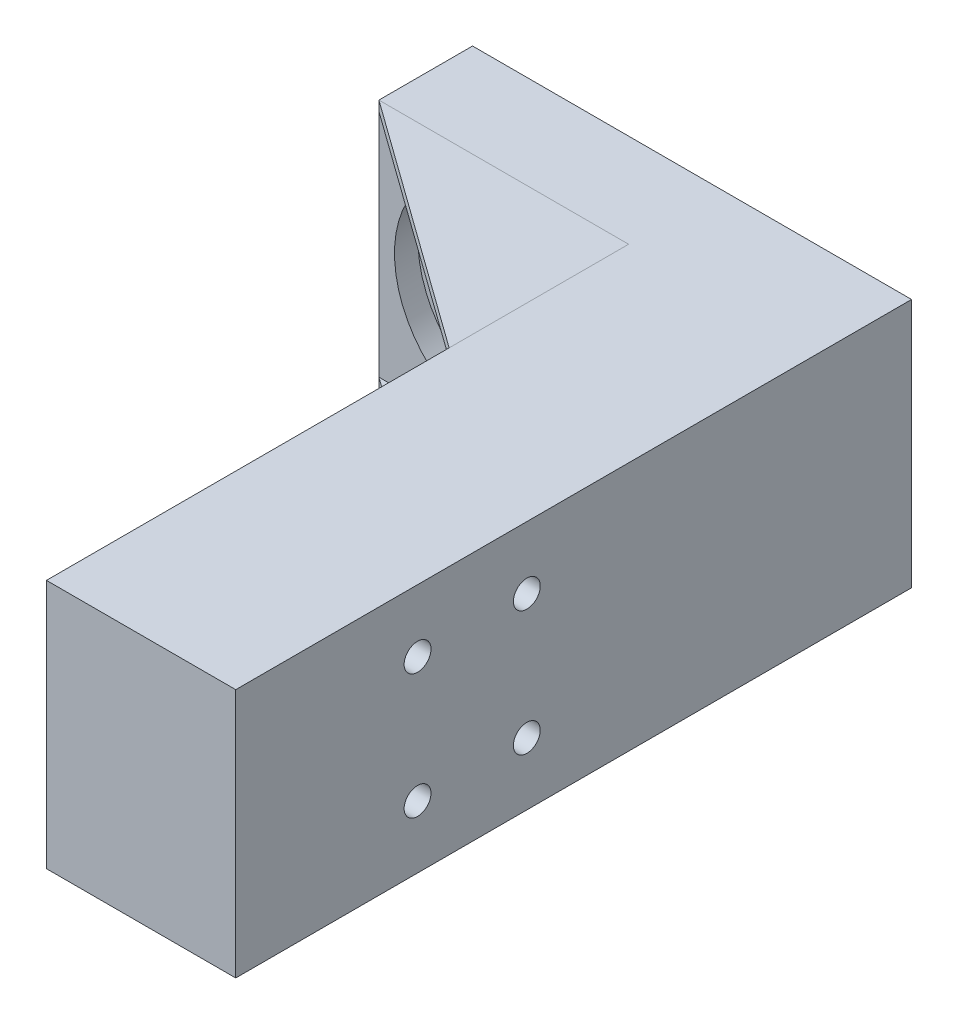
ISO-10303-21;
HEADER;
FILE_DESCRIPTION(('STEP AP214'),'2;1');
FILE_NAME('part.step','',(''),(''),'','','');
FILE_SCHEMA(('AUTOMOTIVE_DESIGN { 1 0 10303 214 1 1 1 1 }'));
ENDSEC;
DATA;
#1=APPLICATION_CONTEXT('core data for automotive mechanical design processes');
#2=APPLICATION_PROTOCOL_DEFINITION('international standard','automotive_design',2000,#1);
#3=PRODUCT_CONTEXT('',#1,'mechanical');
#4=PRODUCT('Part','Part','',(#3));
#5=PRODUCT_RELATED_PRODUCT_CATEGORY('part','',(#4));
#6=PRODUCT_DEFINITION_FORMATION('','',#4);
#7=PRODUCT_DEFINITION_CONTEXT('part definition',#1,'design');
#8=PRODUCT_DEFINITION('design','',#6,#7);
#9=PRODUCT_DEFINITION_SHAPE('','',#8);
#10=(LENGTH_UNIT() NAMED_UNIT(*) SI_UNIT(.MILLI.,.METRE.));
#11=(NAMED_UNIT(*) PLANE_ANGLE_UNIT() SI_UNIT($,.RADIAN.));
#12=(NAMED_UNIT(*) SI_UNIT($,.STERADIAN.) SOLID_ANGLE_UNIT());
#13=UNCERTAINTY_MEASURE_WITH_UNIT(LENGTH_MEASURE(1.E-05),#10,'distance_accuracy_value','');
#14=(GEOMETRIC_REPRESENTATION_CONTEXT(3) GLOBAL_UNCERTAINTY_ASSIGNED_CONTEXT((#13)) GLOBAL_UNIT_ASSIGNED_CONTEXT((#10,
#11,#12)) REPRESENTATION_CONTEXT('',''));
#15=CARTESIAN_POINT('',(0.,0.,0.));
#16=DIRECTION('',(0.,0.,1.));
#17=DIRECTION('',(1.,0.,0.));
#18=AXIS2_PLACEMENT_3D('',#15,#16,#17);
#19=CARTESIAN_POINT('',(0.,30.75,0.));
#20=DIRECTION('',(0.,1.,0.));
#21=DIRECTION('',(0.,0.,1.));
#22=AXIS2_PLACEMENT_3D('',#19,#20,#21);
#23=PLANE('',#22);
#24=DIRECTION('',(-1.,0.,0.));
#25=VECTOR('',#24,1.);
#26=CARTESIAN_POINT('',(0.,30.75,12.));
#27=LINE('',#26,#25);
#28=CARTESIAN_POINT('',(0.,30.75,12.));
#29=VERTEX_POINT('',#28);
#30=CARTESIAN_POINT('',(-32.,30.75,12.));
#31=VERTEX_POINT('',#30);
#32=EDGE_CURVE('E108',#29,#31,#27,.T.);
#33=ORIENTED_EDGE('',*,*,#32,.F.);
#34=DIRECTION('',(0.,0.,-1.));
#35=VECTOR('',#34,1.);
#36=CARTESIAN_POINT('',(0.,30.75,35.));
#37=LINE('',#36,#35);
#38=CARTESIAN_POINT('',(0.,30.75,35.));
#39=VERTEX_POINT('',#38);
#40=EDGE_CURVE('E115',#39,#29,#37,.T.);
#41=ORIENTED_EDGE('',*,*,#40,.F.);
#42=DIRECTION('',(0.812015371342713,0.,0.583636048152576));
#43=VECTOR('',#42,1.);
#44=CARTESIAN_POINT('',(-32.,30.75,12.));
#45=LINE('',#44,#43);
#46=EDGE_CURVE('E88',#31,#39,#45,.T.);
#47=ORIENTED_EDGE('',*,*,#46,.F.);
#48=EDGE_LOOP('',(#33,#41,#47));
#49=FACE_BOUND('',#48,.T.);
#50=ADVANCED_FACE('F79',(#49),#23,.F.);
#51=CARTESIAN_POINT('',(0.,32.,0.));
#52=DIRECTION('',(0.,1.,0.));
#53=DIRECTION('',(0.,0.,1.));
#54=AXIS2_PLACEMENT_3D('',#51,#52,#53);
#55=PLANE('',#54);
#56=DIRECTION('',(-1.,0.,0.));
#57=VECTOR('',#56,1.);
#58=CARTESIAN_POINT('',(0.,32.,12.));
#59=LINE('',#58,#57);
#60=CARTESIAN_POINT('',(0.,32.,12.));
#61=VERTEX_POINT('',#60);
#62=CARTESIAN_POINT('',(-32.,32.,12.));
#63=VERTEX_POINT('',#62);
#64=EDGE_CURVE('E128',#61,#63,#59,.T.);
#65=ORIENTED_EDGE('',*,*,#64,.T.);
#66=DIRECTION('',(0.812015371342713,0.,0.583636048152576));
#67=VECTOR('',#66,1.);
#68=CARTESIAN_POINT('',(-32.,32.,12.));
#69=LINE('',#68,#67);
#70=CARTESIAN_POINT('',(0.,32.,35.));
#71=VERTEX_POINT('',#70);
#72=EDGE_CURVE('E13',#63,#71,#69,.T.);
#73=ORIENTED_EDGE('',*,*,#72,.T.);
#74=DIRECTION('',(0.,0.,-1.));
#75=VECTOR('',#74,1.);
#76=CARTESIAN_POINT('',(0.,32.,35.));
#77=LINE('',#76,#75);
#78=EDGE_CURVE('E122',#71,#61,#77,.T.);
#79=ORIENTED_EDGE('',*,*,#78,.T.);
#80=EDGE_LOOP('',(#65,#73,#79));
#81=FACE_BOUND('',#80,.T.);
#82=ADVANCED_FACE('F152',(#81),#55,.T.);
#83=CARTESIAN_POINT('',(0.,32.,12.));
#84=DIRECTION('',(0.,0.,1.));
#85=DIRECTION('',(1.,0.,0.));
#86=AXIS2_PLACEMENT_3D('',#83,#84,#85);
#87=PLANE('',#86);
#88=ORIENTED_EDGE('',*,*,#32,.T.);
#89=DIRECTION('',(0.,-1.,0.));
#90=VECTOR('',#89,1.);
#91=CARTESIAN_POINT('',(-32.,32.,12.));
#92=LINE('',#91,#90);
#93=EDGE_CURVE('E120',#63,#31,#92,.T.);
#94=ORIENTED_EDGE('',*,*,#93,.F.);
#95=ORIENTED_EDGE('',*,*,#64,.F.);
#96=DIRECTION('',(0.,-1.,0.));
#97=VECTOR('',#96,1.);
#98=CARTESIAN_POINT('',(0.,32.,12.));
#99=LINE('',#98,#97);
#100=EDGE_CURVE('E134',#61,#29,#99,.T.);
#101=ORIENTED_EDGE('',*,*,#100,.T.);
#102=EDGE_LOOP('',(#88,#94,#95,#101));
#103=FACE_BOUND('',#102,.T.);
#104=ADVANCED_FACE('F153',(#103),#87,.F.);
#105=CARTESIAN_POINT('',(0.,32.,35.));
#106=DIRECTION('',(-1.,0.,0.));
#107=DIRECTION('',(0.,0.,1.));
#108=AXIS2_PLACEMENT_3D('',#105,#106,#107);
#109=PLANE('',#108);
#110=ORIENTED_EDGE('',*,*,#40,.T.);
#111=ORIENTED_EDGE('',*,*,#100,.F.);
#112=ORIENTED_EDGE('',*,*,#78,.F.);
#113=DIRECTION('',(0.,-1.,0.));
#114=VECTOR('',#113,1.);
#115=CARTESIAN_POINT('',(0.,32.,35.));
#116=LINE('',#115,#114);
#117=EDGE_CURVE('E119',#71,#39,#116,.T.);
#118=ORIENTED_EDGE('',*,*,#117,.T.);
#119=EDGE_LOOP('',(#110,#111,#112,#118));
#120=FACE_BOUND('',#119,.T.);
#121=ADVANCED_FACE('F124',(#120),#109,.F.);
#122=CARTESIAN_POINT('',(-32.,32.,12.));
#123=DIRECTION('',(0.583636048152576,0.,-0.812015371342713));
#124=DIRECTION('',(-0.812015371342713,0.,-0.583636048152576));
#125=AXIS2_PLACEMENT_3D('',#122,#123,#124);
#126=PLANE('',#125);
#127=ORIENTED_EDGE('',*,*,#46,.T.);
#128=ORIENTED_EDGE('',*,*,#117,.F.);
#129=ORIENTED_EDGE('',*,*,#72,.F.);
#130=ORIENTED_EDGE('',*,*,#93,.T.);
#131=EDGE_LOOP('',(#127,#128,#129,#130));
#132=FACE_BOUND('',#131,.T.);
#133=ADVANCED_FACE('F118',(#132),#126,.F.);
#134=CLOSED_SHELL('',(#50,#82,#104,#121,#133));
#135=MANIFOLD_SOLID_BREP('B2',#134);
#136=CARTESIAN_POINT('',(0.,0.,0.));
#137=DIRECTION('',(-1.,0.,0.));
#138=DIRECTION('',(0.,0.,1.));
#139=AXIS2_PLACEMENT_3D('',#136,#137,#138);
#140=PLANE('',#139);
#141=CARTESIAN_POINT('',(0.,24.,49.3));
#142=DIRECTION('',(-1.,0.,0.));
#143=DIRECTION('',(0.,0.,1.));
#144=AXIS2_PLACEMENT_3D('',#141,#142,#143);
#145=CIRCLE('',#144,1.72);
#146=CARTESIAN_POINT('',(0.,24.,51.02));
#147=VERTEX_POINT('',#146);
#148=EDGE_CURVE('E315',#147,#147,#145,.T.);
#149=ORIENTED_EDGE('',*,*,#148,.F.);
#150=EDGE_LOOP('',(#149));
#151=FACE_BOUND('',#150,.T.);
#152=CARTESIAN_POINT('',(0.,8.,63.3));
#153=DIRECTION('',(-1.,0.,0.));
#154=DIRECTION('',(0.,0.,1.));
#155=AXIS2_PLACEMENT_3D('',#152,#153,#154);
#156=CIRCLE('',#155,1.72);
#157=CARTESIAN_POINT('',(0.,8.,65.02));
#158=VERTEX_POINT('',#157);
#159=EDGE_CURVE('E324',#158,#158,#156,.T.);
#160=ORIENTED_EDGE('',*,*,#159,.F.);
#161=EDGE_LOOP('',(#160));
#162=FACE_BOUND('',#161,.T.);
#163=CARTESIAN_POINT('',(0.,8.,49.3));
#164=DIRECTION('',(-1.,0.,0.));
#165=DIRECTION('',(0.,0.,1.));
#166=AXIS2_PLACEMENT_3D('',#163,#164,#165);
#167=CIRCLE('',#166,1.72);
#168=CARTESIAN_POINT('',(0.,8.,51.02));
#169=VERTEX_POINT('',#168);
#170=EDGE_CURVE('E307',#169,#169,#167,.T.);
#171=ORIENTED_EDGE('',*,*,#170,.F.);
#172=EDGE_LOOP('',(#171));
#173=FACE_BOUND('',#172,.T.);
#174=CARTESIAN_POINT('',(0.,24.,63.3));
#175=DIRECTION('',(-1.,0.,0.));
#176=DIRECTION('',(0.,0.,1.));
#177=AXIS2_PLACEMENT_3D('',#174,#175,#176);
#178=CIRCLE('',#177,1.72);
#179=CARTESIAN_POINT('',(0.,24.,65.02));
#180=VERTEX_POINT('',#179);
#181=EDGE_CURVE('E319',#180,#180,#178,.T.);
#182=ORIENTED_EDGE('',*,*,#181,.F.);
#183=EDGE_LOOP('',(#182));
#184=FACE_BOUND('',#183,.T.);
#185=DIRECTION('',(0.,0.,-1.));
#186=VECTOR('',#185,1.);
#187=CARTESIAN_POINT('',(0.,1.25,12.));
#188=LINE('',#187,#186);
#189=CARTESIAN_POINT('',(0.,1.25,35.));
#190=VERTEX_POINT('',#189);
#191=CARTESIAN_POINT('',(0.,1.25,12.));
#192=VERTEX_POINT('',#191);
#193=EDGE_CURVE('E276',#190,#192,#188,.T.);
#194=ORIENTED_EDGE('',*,*,#193,.F.);
#195=DIRECTION('',(0.,-1.,0.));
#196=VECTOR('',#195,1.);
#197=CARTESIAN_POINT('',(0.,1.25,35.));
#198=LINE('',#197,#196);
#199=CARTESIAN_POINT('',(0.,0.,35.));
#200=VERTEX_POINT('',#199);
#201=EDGE_CURVE('E285',#190,#200,#198,.T.);
#202=ORIENTED_EDGE('',*,*,#201,.T.);
#203=DIRECTION('',(0.,0.,-1.));
#204=VECTOR('',#203,1.);
#205=CARTESIAN_POINT('',(0.,0.,0.));
#206=LINE('',#205,#204);
#207=CARTESIAN_POINT('',(0.,0.,86.6));
#208=VERTEX_POINT('',#207);
#209=EDGE_CURVE('E383',#208,#200,#206,.T.);
#210=ORIENTED_EDGE('',*,*,#209,.F.);
#211=DIRECTION('',(0.,-1.,0.));
#212=VECTOR('',#211,1.);
#213=CARTESIAN_POINT('',(0.,0.,86.6));
#214=LINE('',#213,#212);
#215=CARTESIAN_POINT('',(0.,32.,86.6));
#216=VERTEX_POINT('',#215);
#217=EDGE_CURVE('E246',#216,#208,#214,.T.);
#218=ORIENTED_EDGE('',*,*,#217,.F.);
#219=DIRECTION('',(0.,0.,1.));
#220=VECTOR('',#219,1.);
#221=CARTESIAN_POINT('',(0.,32.,0.));
#222=LINE('',#221,#220);
#223=CARTESIAN_POINT('',(0.,32.,12.));
#224=VERTEX_POINT('',#223);
#225=EDGE_CURVE('E402',#224,#216,#222,.T.);
#226=ORIENTED_EDGE('',*,*,#225,.F.);
#227=DIRECTION('',(0.,1.,0.));
#228=VECTOR('',#227,1.);
#229=CARTESIAN_POINT('',(0.,0.,12.));
#230=LINE('',#229,#228);
#231=EDGE_CURVE('E297',#192,#224,#230,.T.);
#232=ORIENTED_EDGE('',*,*,#231,.F.);
#233=EDGE_LOOP('',(#194,#202,#210,#218,#226,#232));
#234=FACE_BOUND('',#233,.T.);
#235=ADVANCED_FACE('F194',(#151,#162,#173,#184,#234),#140,.T.);
#236=CARTESIAN_POINT('',(0.,0.,12.));
#237=DIRECTION('',(0.,1.,0.));
#238=DIRECTION('',(0.,0.,1.));
#239=AXIS2_PLACEMENT_3D('',#236,#237,#238);
#240=PLANE('',#239);
#241=DIRECTION('',(1.,0.,0.));
#242=VECTOR('',#241,1.);
#243=CARTESIAN_POINT('',(0.,0.,0.));
#244=LINE('',#243,#242);
#245=CARTESIAN_POINT('',(-32.,0.,0.));
#246=VERTEX_POINT('',#245);
#247=CARTESIAN_POINT('',(24.2564424431943,0.,0.));
#248=VERTEX_POINT('',#247);
#249=EDGE_CURVE('E254',#246,#248,#244,.T.);
#250=ORIENTED_EDGE('',*,*,#249,.T.);
#251=DIRECTION('',(0.,0.,-1.));
#252=VECTOR('',#251,1.);
#253=CARTESIAN_POINT('',(24.2564424431943,0.,0.));
#254=LINE('',#253,#252);
#255=CARTESIAN_POINT('',(24.2564424431943,0.,86.6));
#256=VERTEX_POINT('',#255);
#257=EDGE_CURVE('E387',#256,#248,#254,.T.);
#258=ORIENTED_EDGE('',*,*,#257,.F.);
#259=DIRECTION('',(-1.,0.,0.));
#260=VECTOR('',#259,1.);
#261=CARTESIAN_POINT('',(24.2564424431943,0.,86.6));
#262=LINE('',#261,#260);
#263=EDGE_CURVE('E399',#256,#208,#262,.T.);
#264=ORIENTED_EDGE('',*,*,#263,.T.);
#265=ORIENTED_EDGE('',*,*,#209,.T.);
#266=DIRECTION('',(0.812015371342713,0.,0.583636048152575));
#267=VECTOR('',#266,1.);
#268=CARTESIAN_POINT('',(0.,0.,35.));
#269=LINE('',#268,#267);
#270=CARTESIAN_POINT('',(-32.,0.,12.));
#271=VERTEX_POINT('',#270);
#272=EDGE_CURVE('E282',#271,#200,#269,.T.);
#273=ORIENTED_EDGE('',*,*,#272,.F.);
#274=DIRECTION('',(0.,0.,-1.));
#275=VECTOR('',#274,1.);
#276=CARTESIAN_POINT('',(-32.,0.,12.));
#277=LINE('',#276,#275);
#278=EDGE_CURVE('E204',#271,#246,#277,.T.);
#279=ORIENTED_EDGE('',*,*,#278,.T.);
#280=EDGE_LOOP('',(#250,#258,#264,#265,#273,#279));
#281=FACE_BOUND('',#280,.T.);
#282=ADVANCED_FACE('F196',(#281),#240,.F.);
#283=CARTESIAN_POINT('',(0.,32.,12.));
#284=DIRECTION('',(0.,-1.,0.));
#285=DIRECTION('',(0.,0.,-1.));
#286=AXIS2_PLACEMENT_3D('',#283,#284,#285);
#287=PLANE('',#286);
#288=DIRECTION('',(-1.,0.,0.));
#289=VECTOR('',#288,1.);
#290=CARTESIAN_POINT('',(0.,32.,0.));
#291=LINE('',#290,#289);
#292=CARTESIAN_POINT('',(24.2564424431943,32.,0.));
#293=VERTEX_POINT('',#292);
#294=CARTESIAN_POINT('',(-32.,32.,0.));
#295=VERTEX_POINT('',#294);
#296=EDGE_CURVE('E222',#293,#295,#291,.T.);
#297=ORIENTED_EDGE('',*,*,#296,.T.);
#298=DIRECTION('',(0.,0.,-1.));
#299=VECTOR('',#298,1.);
#300=CARTESIAN_POINT('',(-32.,32.,12.));
#301=LINE('',#300,#299);
#302=CARTESIAN_POINT('',(-32.,32.,12.));
#303=VERTEX_POINT('',#302);
#304=EDGE_CURVE('E77',#303,#295,#301,.T.);
#305=ORIENTED_EDGE('',*,*,#304,.F.);
#306=DIRECTION('',(-1.,0.,0.));
#307=VECTOR('',#306,1.);
#308=CARTESIAN_POINT('',(0.,32.,12.));
#309=LINE('',#308,#307);
#310=EDGE_CURVE('E212',#224,#303,#309,.T.);
#311=ORIENTED_EDGE('',*,*,#310,.F.);
#312=ORIENTED_EDGE('',*,*,#225,.T.);
#313=DIRECTION('',(-1.,0.,0.));
#314=VECTOR('',#313,1.);
#315=CARTESIAN_POINT('',(24.2564424431943,32.,86.6));
#316=LINE('',#315,#314);
#317=CARTESIAN_POINT('',(24.2564424431943,32.,86.6));
#318=VERTEX_POINT('',#317);
#319=EDGE_CURVE('E409',#318,#216,#316,.T.);
#320=ORIENTED_EDGE('',*,*,#319,.F.);
#321=DIRECTION('',(0.,0.,1.));
#322=VECTOR('',#321,1.);
#323=CARTESIAN_POINT('',(24.2564424431943,32.,0.));
#324=LINE('',#323,#322);
#325=EDGE_CURVE('E394',#293,#318,#324,.T.);
#326=ORIENTED_EDGE('',*,*,#325,.F.);
#327=EDGE_LOOP('',(#297,#305,#311,#312,#320,#326));
#328=FACE_BOUND('',#327,.T.);
#329=ADVANCED_FACE('F433',(#328),#287,.F.);
#330=CARTESIAN_POINT('',(-32.,0.,12.));
#331=DIRECTION('',(1.,0.,0.));
#332=DIRECTION('',(0.,0.,-1.));
#333=AXIS2_PLACEMENT_3D('',#330,#331,#332);
#334=PLANE('',#333);
#335=DIRECTION('',(0.,-1.,0.));
#336=VECTOR('',#335,1.);
#337=CARTESIAN_POINT('',(-32.,0.,0.));
#338=LINE('',#337,#336);
#339=EDGE_CURVE('E414',#295,#246,#338,.T.);
#340=ORIENTED_EDGE('',*,*,#339,.T.);
#341=ORIENTED_EDGE('',*,*,#278,.F.);
#342=DIRECTION('',(0.,-1.,0.));
#343=VECTOR('',#342,1.);
#344=CARTESIAN_POINT('',(-32.,1.25,12.));
#345=LINE('',#344,#343);
#346=CARTESIAN_POINT('',(-32.,1.25,12.));
#347=VERTEX_POINT('',#346);
#348=EDGE_CURVE('E293',#347,#271,#345,.T.);
#349=ORIENTED_EDGE('',*,*,#348,.F.);
#350=DIRECTION('',(0.,-1.,0.));
#351=VECTOR('',#350,1.);
#352=CARTESIAN_POINT('',(-32.,0.,12.));
#353=LINE('',#352,#351);
#354=EDGE_CURVE('E417',#303,#347,#353,.T.);
#355=ORIENTED_EDGE('',*,*,#354,.F.);
#356=ORIENTED_EDGE('',*,*,#304,.T.);
#357=EDGE_LOOP('',(#340,#341,#349,#355,#356));
#358=FACE_BOUND('',#357,.T.);
#359=ADVANCED_FACE('F435',(#358),#334,.F.);
#360=CARTESIAN_POINT('',(0.,0.,12.));
#361=DIRECTION('',(0.,0.,-1.));
#362=DIRECTION('',(-1.,0.,0.));
#363=AXIS2_PLACEMENT_3D('',#360,#361,#362);
#364=PLANE('',#363);
#365=CARTESIAN_POINT('',(-16.,16.,12.));
#366=DIRECTION('',(0.,0.,1.));
#367=DIRECTION('',(1.,0.,0.));
#368=AXIS2_PLACEMENT_3D('',#365,#366,#367);
#369=CIRCLE('',#368,14.);
#370=CARTESIAN_POINT('',(-2.,16.,12.));
#371=VERTEX_POINT('',#370);
#372=EDGE_CURVE('E375',#371,#371,#369,.T.);
#373=ORIENTED_EDGE('',*,*,#372,.F.);
#374=EDGE_LOOP('',(#373));
#375=FACE_BOUND('',#374,.T.);
#376=ORIENTED_EDGE('',*,*,#354,.T.);
#377=DIRECTION('',(-1.,0.,0.));
#378=VECTOR('',#377,1.);
#379=CARTESIAN_POINT('',(-32.,1.25,12.));
#380=LINE('',#379,#378);
#381=EDGE_CURVE('E278',#192,#347,#380,.T.);
#382=ORIENTED_EDGE('',*,*,#381,.F.);
#383=ORIENTED_EDGE('',*,*,#231,.T.);
#384=ORIENTED_EDGE('',*,*,#310,.T.);
#385=EDGE_LOOP('',(#376,#382,#383,#384));
#386=FACE_BOUND('',#385,.T.);
#387=ADVANCED_FACE('F436',(#375,#386),#364,.F.);
#388=CARTESIAN_POINT('',(0.,0.,0.));
#389=DIRECTION('',(0.,0.,-1.));
#390=DIRECTION('',(-1.,0.,0.));
#391=AXIS2_PLACEMENT_3D('',#388,#389,#390);
#392=PLANE('',#391);
#393=CARTESIAN_POINT('',(-16.,25.35,0.));
#394=DIRECTION('',(0.,0.,1.));
#395=DIRECTION('',(1.,0.,0.));
#396=AXIS2_PLACEMENT_3D('',#393,#394,#395);
#397=CIRCLE('',#396,1.72);
#398=CARTESIAN_POINT('',(-14.28,25.35,0.));
#399=VERTEX_POINT('',#398);
#400=EDGE_CURVE('E339',#399,#399,#397,.T.);
#401=ORIENTED_EDGE('',*,*,#400,.T.);
#402=EDGE_LOOP('',(#401));
#403=FACE_BOUND('',#402,.T.);
#404=CARTESIAN_POINT('',(-16.,6.65,0.));
#405=DIRECTION('',(0.,0.,1.));
#406=DIRECTION('',(1.,0.,0.));
#407=AXIS2_PLACEMENT_3D('',#404,#405,#406);
#408=CIRCLE('',#407,1.72);
#409=CARTESIAN_POINT('',(-14.28,6.65,0.));
#410=VERTEX_POINT('',#409);
#411=EDGE_CURVE('E352',#410,#410,#408,.T.);
#412=ORIENTED_EDGE('',*,*,#411,.T.);
#413=EDGE_LOOP('',(#412));
#414=FACE_BOUND('',#413,.T.);
#415=CARTESIAN_POINT('',(-6.65,15.9999999999998,0.));
#416=DIRECTION('',(0.,0.,1.));
#417=DIRECTION('',(1.,0.,0.));
#418=AXIS2_PLACEMENT_3D('',#415,#416,#417);
#419=CIRCLE('',#418,1.72000000000007);
#420=CARTESIAN_POINT('',(-4.92999999999993,15.9999999999998,0.));
#421=VERTEX_POINT('',#420);
#422=EDGE_CURVE('E360',#421,#421,#419,.T.);
#423=ORIENTED_EDGE('',*,*,#422,.T.);
#424=EDGE_LOOP('',(#423));
#425=FACE_BOUND('',#424,.T.);
#426=CARTESIAN_POINT('',(-25.3078363428139,16.,0.));
#427=DIRECTION('',(0.,0.,1.));
#428=DIRECTION('',(1.,0.,0.));
#429=AXIS2_PLACEMENT_3D('',#426,#427,#428);
#430=CIRCLE('',#429,1.72);
#431=CARTESIAN_POINT('',(-23.5878363428139,16.,0.));
#432=VERTEX_POINT('',#431);
#433=EDGE_CURVE('E335',#432,#432,#430,.T.);
#434=ORIENTED_EDGE('',*,*,#433,.T.);
#435=EDGE_LOOP('',(#434));
#436=FACE_BOUND('',#435,.T.);
#437=CARTESIAN_POINT('',(-15.9578363428139,16.1108483942343,0.));
#438=DIRECTION('',(0.,0.,1.));
#439=DIRECTION('',(1.,0.,0.));
#440=AXIS2_PLACEMENT_3D('',#437,#438,#439);
#441=CIRCLE('',#440,3.);
#442=CARTESIAN_POINT('',(-12.9578363428139,16.1108483942343,0.));
#443=VERTEX_POINT('',#442);
#444=EDGE_CURVE('E371',#443,#443,#441,.T.);
#445=ORIENTED_EDGE('',*,*,#444,.T.);
#446=EDGE_LOOP('',(#445));
#447=FACE_BOUND('',#446,.T.);
#448=ORIENTED_EDGE('',*,*,#249,.F.);
#449=ORIENTED_EDGE('',*,*,#339,.F.);
#450=ORIENTED_EDGE('',*,*,#296,.F.);
#451=DIRECTION('',(0.,1.,0.));
#452=VECTOR('',#451,1.);
#453=CARTESIAN_POINT('',(24.2564424431943,0.,0.));
#454=LINE('',#453,#452);
#455=EDGE_CURVE('E390',#248,#293,#454,.T.);
#456=ORIENTED_EDGE('',*,*,#455,.F.);
#457=EDGE_LOOP('',(#448,#449,#450,#456));
#458=FACE_BOUND('',#457,.T.);
#459=ADVANCED_FACE('F430',(#403,#414,#425,#436,#447,#458),#392,.T.);
#460=CARTESIAN_POINT('',(24.2564424431943,0.,86.6));
#461=DIRECTION('',(0.,0.,-1.));
#462=DIRECTION('',(-1.,0.,0.));
#463=AXIS2_PLACEMENT_3D('',#460,#461,#462);
#464=PLANE('',#463);
#465=ORIENTED_EDGE('',*,*,#217,.T.);
#466=ORIENTED_EDGE('',*,*,#263,.F.);
#467=DIRECTION('',(0.,-1.,0.));
#468=VECTOR('',#467,1.);
#469=CARTESIAN_POINT('',(24.2564424431943,0.,86.6));
#470=LINE('',#469,#468);
#471=EDGE_CURVE('E231',#318,#256,#470,.T.);
#472=ORIENTED_EDGE('',*,*,#471,.F.);
#473=ORIENTED_EDGE('',*,*,#319,.T.);
#474=EDGE_LOOP('',(#465,#466,#472,#473));
#475=FACE_BOUND('',#474,.T.);
#476=ADVANCED_FACE('F445',(#475),#464,.F.);
#477=CARTESIAN_POINT('',(24.2564424431943,0.,0.));
#478=DIRECTION('',(-1.,0.,0.));
#479=DIRECTION('',(0.,0.,1.));
#480=AXIS2_PLACEMENT_3D('',#477,#478,#479);
#481=PLANE('',#480);
#482=CARTESIAN_POINT('',(24.2564424431943,24.,49.3));
#483=DIRECTION('',(-1.,0.,0.));
#484=DIRECTION('',(0.,0.,1.));
#485=AXIS2_PLACEMENT_3D('',#482,#483,#484);
#486=CIRCLE('',#485,1.72);
#487=CARTESIAN_POINT('',(24.2564424431943,24.,51.02));
#488=VERTEX_POINT('',#487);
#489=EDGE_CURVE('E320',#488,#488,#486,.T.);
#490=ORIENTED_EDGE('',*,*,#489,.T.);
#491=EDGE_LOOP('',(#490));
#492=FACE_BOUND('',#491,.T.);
#493=CARTESIAN_POINT('',(24.2564424431943,8.,63.3));
#494=DIRECTION('',(-1.,0.,0.));
#495=DIRECTION('',(0.,0.,1.));
#496=AXIS2_PLACEMENT_3D('',#493,#494,#495);
#497=CIRCLE('',#496,1.72);
#498=CARTESIAN_POINT('',(24.2564424431943,8.,65.02));
#499=VERTEX_POINT('',#498);
#500=EDGE_CURVE('E311',#499,#499,#497,.T.);
#501=ORIENTED_EDGE('',*,*,#500,.T.);
#502=EDGE_LOOP('',(#501));
#503=FACE_BOUND('',#502,.T.);
#504=CARTESIAN_POINT('',(24.2564424431943,8.,49.3));
#505=DIRECTION('',(-1.,0.,0.));
#506=DIRECTION('',(0.,0.,1.));
#507=AXIS2_PLACEMENT_3D('',#504,#505,#506);
#508=CIRCLE('',#507,1.72);
#509=CARTESIAN_POINT('',(24.2564424431943,8.,51.02));
#510=VERTEX_POINT('',#509);
#511=EDGE_CURVE('E292',#510,#510,#508,.T.);
#512=ORIENTED_EDGE('',*,*,#511,.T.);
#513=EDGE_LOOP('',(#512));
#514=FACE_BOUND('',#513,.T.);
#515=CARTESIAN_POINT('',(24.2564424431943,24.,63.3));
#516=DIRECTION('',(-1.,0.,0.));
#517=DIRECTION('',(0.,0.,1.));
#518=AXIS2_PLACEMENT_3D('',#515,#516,#517);
#519=CIRCLE('',#518,1.72);
#520=CARTESIAN_POINT('',(24.2564424431943,24.,65.02));
#521=VERTEX_POINT('',#520);
#522=EDGE_CURVE('E331',#521,#521,#519,.T.);
#523=ORIENTED_EDGE('',*,*,#522,.T.);
#524=EDGE_LOOP('',(#523));
#525=FACE_BOUND('',#524,.T.);
#526=ORIENTED_EDGE('',*,*,#257,.T.);
#527=ORIENTED_EDGE('',*,*,#455,.T.);
#528=ORIENTED_EDGE('',*,*,#325,.T.);
#529=ORIENTED_EDGE('',*,*,#471,.T.);
#530=EDGE_LOOP('',(#526,#527,#528,#529));
#531=FACE_BOUND('',#530,.T.);
#532=ADVANCED_FACE('F431',(#492,#503,#514,#525,#531),#481,.F.);
#533=CARTESIAN_POINT('',(-16.,16.,9.));
#534=DIRECTION('',(0.,0.,1.));
#535=DIRECTION('',(1.,0.,0.));
#536=AXIS2_PLACEMENT_3D('',#533,#534,#535);
#537=CYLINDRICAL_SURFACE('',#536,14.);
#538=CARTESIAN_POINT('',(-16.,16.,9.));
#539=DIRECTION('',(0.,0.,1.));
#540=DIRECTION('',(1.,0.,0.));
#541=AXIS2_PLACEMENT_3D('',#538,#539,#540);
#542=CIRCLE('',#541,14.);
#543=CARTESIAN_POINT('',(-2.,16.,9.));
#544=VERTEX_POINT('',#543);
#545=EDGE_CURVE('E379',#544,#544,#542,.T.);
#546=ORIENTED_EDGE('',*,*,#545,.F.);
#547=EDGE_LOOP('',(#546));
#548=FACE_BOUND('',#547,.T.);
#549=ORIENTED_EDGE('',*,*,#372,.T.);
#550=EDGE_LOOP('',(#549));
#551=FACE_BOUND('',#550,.T.);
#552=ADVANCED_FACE('F468',(#548,#551),#537,.F.);
#553=CARTESIAN_POINT('',(-16.,16.,9.));
#554=DIRECTION('',(0.,0.,1.));
#555=DIRECTION('',(1.,0.,0.));
#556=AXIS2_PLACEMENT_3D('',#553,#554,#555);
#557=PLANE('',#556);
#558=CARTESIAN_POINT('',(-16.,25.35,9.));
#559=DIRECTION('',(0.,0.,1.));
#560=DIRECTION('',(1.,0.,0.));
#561=AXIS2_PLACEMENT_3D('',#558,#559,#560);
#562=CIRCLE('',#561,1.72);
#563=CARTESIAN_POINT('',(-14.28,25.35,9.));
#564=VERTEX_POINT('',#563);
#565=EDGE_CURVE('E344',#564,#564,#562,.T.);
#566=ORIENTED_EDGE('',*,*,#565,.F.);
#567=EDGE_LOOP('',(#566));
#568=FACE_BOUND('',#567,.T.);
#569=CARTESIAN_POINT('',(-16.,6.65,9.));
#570=DIRECTION('',(0.,0.,1.));
#571=DIRECTION('',(1.,0.,0.));
#572=AXIS2_PLACEMENT_3D('',#569,#570,#571);
#573=CIRCLE('',#572,1.72);
#574=CARTESIAN_POINT('',(-14.28,6.65,9.));
#575=VERTEX_POINT('',#574);
#576=EDGE_CURVE('E348',#575,#575,#573,.T.);
#577=ORIENTED_EDGE('',*,*,#576,.F.);
#578=EDGE_LOOP('',(#577));
#579=FACE_BOUND('',#578,.T.);
#580=CARTESIAN_POINT('',(-6.65,15.9999999999998,9.));
#581=DIRECTION('',(0.,0.,1.));
#582=DIRECTION('',(1.,0.,0.));
#583=AXIS2_PLACEMENT_3D('',#580,#581,#582);
#584=CIRCLE('',#583,1.72000000000007);
#585=CARTESIAN_POINT('',(-4.92999999999993,15.9999999999998,9.));
#586=VERTEX_POINT('',#585);
#587=EDGE_CURVE('E356',#586,#586,#584,.T.);
#588=ORIENTED_EDGE('',*,*,#587,.F.);
#589=EDGE_LOOP('',(#588));
#590=FACE_BOUND('',#589,.T.);
#591=CARTESIAN_POINT('',(-25.3078363428139,16.,9.));
#592=DIRECTION('',(0.,0.,1.));
#593=DIRECTION('',(1.,0.,0.));
#594=AXIS2_PLACEMENT_3D('',#591,#592,#593);
#595=CIRCLE('',#594,1.72);
#596=CARTESIAN_POINT('',(-23.5878363428139,16.,9.));
#597=VERTEX_POINT('',#596);
#598=EDGE_CURVE('E364',#597,#597,#595,.T.);
#599=ORIENTED_EDGE('',*,*,#598,.F.);
#600=EDGE_LOOP('',(#599));
#601=FACE_BOUND('',#600,.T.);
#602=CARTESIAN_POINT('',(-15.9578363428139,16.1108483942343,9.));
#603=DIRECTION('',(0.,0.,1.));
#604=DIRECTION('',(1.,0.,0.));
#605=AXIS2_PLACEMENT_3D('',#602,#603,#604);
#606=CIRCLE('',#605,3.);
#607=CARTESIAN_POINT('',(-12.9578363428139,16.1108483942343,9.));
#608=VERTEX_POINT('',#607);
#609=EDGE_CURVE('E343',#608,#608,#606,.T.);
#610=ORIENTED_EDGE('',*,*,#609,.F.);
#611=EDGE_LOOP('',(#610));
#612=FACE_BOUND('',#611,.T.);
#613=ORIENTED_EDGE('',*,*,#545,.T.);
#614=EDGE_LOOP('',(#613));
#615=FACE_BOUND('',#614,.T.);
#616=ADVANCED_FACE('F474',(#568,#579,#590,#601,#612,#615),#557,.T.);
#617=CARTESIAN_POINT('',(-15.9578363428139,16.1108483942343,0.));
#618=DIRECTION('',(0.,0.,1.));
#619=DIRECTION('',(1.,0.,0.));
#620=AXIS2_PLACEMENT_3D('',#617,#618,#619);
#621=CYLINDRICAL_SURFACE('',#620,3.);
#622=ORIENTED_EDGE('',*,*,#444,.F.);
#623=EDGE_LOOP('',(#622));
#624=FACE_BOUND('',#623,.T.);
#625=ORIENTED_EDGE('',*,*,#609,.T.);
#626=EDGE_LOOP('',(#625));
#627=FACE_BOUND('',#626,.T.);
#628=ADVANCED_FACE('F513',(#624,#627),#621,.F.);
#629=CARTESIAN_POINT('',(-25.3078363428139,16.,0.));
#630=DIRECTION('',(0.,0.,1.));
#631=DIRECTION('',(1.,0.,0.));
#632=AXIS2_PLACEMENT_3D('',#629,#630,#631);
#633=CYLINDRICAL_SURFACE('',#632,1.72);
#634=ORIENTED_EDGE('',*,*,#433,.F.);
#635=EDGE_LOOP('',(#634));
#636=FACE_BOUND('',#635,.T.);
#637=ORIENTED_EDGE('',*,*,#598,.T.);
#638=EDGE_LOOP('',(#637));
#639=FACE_BOUND('',#638,.T.);
#640=ADVANCED_FACE('F509',(#636,#639),#633,.F.);
#641=CARTESIAN_POINT('',(-6.65,15.9999999999998,0.));
#642=DIRECTION('',(0.,0.,1.));
#643=DIRECTION('',(1.,0.,0.));
#644=AXIS2_PLACEMENT_3D('',#641,#642,#643);
#645=CYLINDRICAL_SURFACE('',#644,1.72000000000007);
#646=ORIENTED_EDGE('',*,*,#422,.F.);
#647=EDGE_LOOP('',(#646));
#648=FACE_BOUND('',#647,.T.);
#649=ORIENTED_EDGE('',*,*,#587,.T.);
#650=EDGE_LOOP('',(#649));
#651=FACE_BOUND('',#650,.T.);
#652=ADVANCED_FACE('F505',(#648,#651),#645,.F.);
#653=CARTESIAN_POINT('',(-16.,6.65,0.));
#654=DIRECTION('',(0.,0.,1.));
#655=DIRECTION('',(1.,0.,0.));
#656=AXIS2_PLACEMENT_3D('',#653,#654,#655);
#657=CYLINDRICAL_SURFACE('',#656,1.72);
#658=ORIENTED_EDGE('',*,*,#411,.F.);
#659=EDGE_LOOP('',(#658));
#660=FACE_BOUND('',#659,.T.);
#661=ORIENTED_EDGE('',*,*,#576,.T.);
#662=EDGE_LOOP('',(#661));
#663=FACE_BOUND('',#662,.T.);
#664=ADVANCED_FACE('F497',(#660,#663),#657,.F.);
#665=CARTESIAN_POINT('',(-16.,25.35,0.));
#666=DIRECTION('',(0.,0.,1.));
#667=DIRECTION('',(1.,0.,0.));
#668=AXIS2_PLACEMENT_3D('',#665,#666,#667);
#669=CYLINDRICAL_SURFACE('',#668,1.72);
#670=ORIENTED_EDGE('',*,*,#400,.F.);
#671=EDGE_LOOP('',(#670));
#672=FACE_BOUND('',#671,.T.);
#673=ORIENTED_EDGE('',*,*,#565,.T.);
#674=EDGE_LOOP('',(#673));
#675=FACE_BOUND('',#674,.T.);
#676=ADVANCED_FACE('F487',(#672,#675),#669,.F.);
#677=CARTESIAN_POINT('',(24.2564424431943,24.,63.3));
#678=DIRECTION('',(-1.,0.,0.));
#679=DIRECTION('',(0.,0.,1.));
#680=AXIS2_PLACEMENT_3D('',#677,#678,#679);
#681=CYLINDRICAL_SURFACE('',#680,1.72);
#682=CARTESIAN_POINT('',(24.2564424431943,24.,65.02));
#683=CARTESIAN_POINT('',(24.0037711677444,24.,65.02));
#684=CARTESIAN_POINT('',(23.7510998922945,24.,65.02));
#685=CARTESIAN_POINT('',(23.2457573413946,24.,65.02));
#686=CARTESIAN_POINT('',(22.9930860659446,24.,65.02));
#687=CARTESIAN_POINT('',(22.4877435150448,24.,65.02));
#688=CARTESIAN_POINT('',(22.2350722395948,24.,65.02));
#689=CARTESIAN_POINT('',(21.7297296886949,24.,65.02));
#690=CARTESIAN_POINT('',(21.477058413245,24.,65.02));
#691=CARTESIAN_POINT('',(20.9717158623451,24.,65.02));
#692=CARTESIAN_POINT('',(20.7190445868952,24.,65.02));
#693=CARTESIAN_POINT('',(20.2137020359953,24.,65.02));
#694=CARTESIAN_POINT('',(19.9610307605453,24.,65.02));
#695=CARTESIAN_POINT('',(19.4556882096455,24.,65.02));
#696=CARTESIAN_POINT('',(19.2030169341955,24.,65.02));
#697=CARTESIAN_POINT('',(18.6976743832956,24.,65.02));
#698=CARTESIAN_POINT('',(18.4450031078457,24.,65.02));
#699=CARTESIAN_POINT('',(17.9396605569458,24.,65.02));
#700=CARTESIAN_POINT('',(17.6869892814959,24.,65.02));
#701=CARTESIAN_POINT('',(17.181646730596,24.,65.02));
#702=CARTESIAN_POINT('',(16.9289754551461,24.,65.02));
#703=CARTESIAN_POINT('',(16.4236329042462,24.,65.02));
#704=CARTESIAN_POINT('',(16.1709616287962,24.,65.02));
#705=CARTESIAN_POINT('',(15.6656190778964,24.,65.02));
#706=CARTESIAN_POINT('',(15.4129478024464,24.,65.02));
#707=CARTESIAN_POINT('',(14.9076052515465,24.,65.02));
#708=CARTESIAN_POINT('',(14.6549339760966,24.,65.02));
#709=CARTESIAN_POINT('',(14.1495914251967,24.,65.02));
#710=CARTESIAN_POINT('',(13.8969201497468,24.,65.02));
#711=CARTESIAN_POINT('',(13.3915775988469,24.,65.02));
#712=CARTESIAN_POINT('',(13.1389063233969,24.,65.02));
#713=CARTESIAN_POINT('',(12.6335637724971,24.,65.02));
#714=CARTESIAN_POINT('',(12.3808924970471,24.,65.02));
#715=CARTESIAN_POINT('',(11.8755499461472,24.,65.02));
#716=CARTESIAN_POINT('',(11.6228786706973,24.,65.02));
#717=CARTESIAN_POINT('',(11.1175361197974,24.,65.02));
#718=CARTESIAN_POINT('',(10.8648648443475,24.,65.02));
#719=CARTESIAN_POINT('',(10.3595222934476,24.,65.02));
#720=CARTESIAN_POINT('',(10.1068510179976,24.,65.02));
#721=CARTESIAN_POINT('',(9.60150846709776,24.,65.02));
#722=CARTESIAN_POINT('',(9.34883719164782,24.,65.02));
#723=CARTESIAN_POINT('',(8.84349464074794,24.,65.02));
#724=CARTESIAN_POINT('',(8.590823365298,24.,65.02));
#725=CARTESIAN_POINT('',(8.08548081439812,24.,65.02));
#726=CARTESIAN_POINT('',(7.83280953894818,24.,65.02));
#727=CARTESIAN_POINT('',(7.3274669880483,24.,65.02));
#728=CARTESIAN_POINT('',(7.07479571259835,24.,65.02));
#729=CARTESIAN_POINT('',(6.56945316169847,24.,65.02));
#730=CARTESIAN_POINT('',(6.31678188624853,24.,65.02));
#731=CARTESIAN_POINT('',(5.81143933534865,24.,65.02));
#732=CARTESIAN_POINT('',(5.55876805989871,24.,65.02));
#733=CARTESIAN_POINT('',(5.05342550899883,24.,65.02));
#734=CARTESIAN_POINT('',(4.80075423354888,24.,65.02));
#735=CARTESIAN_POINT('',(4.295411682649,24.,65.02));
#736=CARTESIAN_POINT('',(4.04274040719906,24.,65.02));
#737=CARTESIAN_POINT('',(3.53739785629918,24.,65.02));
#738=CARTESIAN_POINT('',(3.28472658084924,24.,65.02));
#739=CARTESIAN_POINT('',(2.77938402994936,24.,65.02));
#740=CARTESIAN_POINT('',(2.52671275449942,24.,65.02));
#741=CARTESIAN_POINT('',(2.02137020359953,24.,65.02));
#742=CARTESIAN_POINT('',(1.76869892814959,24.,65.02));
#743=CARTESIAN_POINT('',(1.26335637724971,24.,65.02));
#744=CARTESIAN_POINT('',(1.01068510179977,24.,65.02));
#745=CARTESIAN_POINT('',(0.505342550899886,24.,65.02));
#746=CARTESIAN_POINT('',(0.252671275449945,24.,65.02));
#747=CARTESIAN_POINT('',(0.,24.,65.02));
#748=B_SPLINE_CURVE_WITH_KNOTS('',3,(#682,#683,#684,#685,#686,#687,#688,#689,#690,#691,#692,
#693,#694,#695,#696,#697,#698,#699,#700,#701,#702,#703,#704,#705,#706,#707,#708,#709,#710,#711,
#712,#713,#714,#715,#716,#717,#718,#719,#720,#721,#722,#723,#724,#725,#726,#727,#728,#729,#730,
#731,#732,#733,#734,#735,#736,#737,#738,#739,#740,#741,#742,#743,#744,#745,#746,#747),
.UNSPECIFIED.,.F.,.F.,(4,2,2,2,2,2,2,2,2,2,2,2,2,2,2,2,2,2,2,2,2,2,2,2,2,2,2,2,2,2,2,2,4),(0.,
0.758013826349824,1.51602765269965,2.27404147904947,3.03205530539929,3.79006913174912,
4.54808295809894,5.30609678444876,6.06411061079859,6.82212443714841,7.58013826349823,
8.33815208984806,9.09616591619788,9.85417974254771,10.6121935688975,11.3702073952474,
12.1282212215972,12.886235047947,13.6442488742968,14.4022627006466,15.1602765269965,
15.9182903533463,16.6763041796961,17.4343180060459,18.1923318323958,18.9503456587456,
19.7083594850954,20.4663733114452,21.2243871377951,21.9824009641449,22.7404147904947,
23.4984286168445,24.2564424431943),.UNSPECIFIED.);
#749=EDGE_CURVE('BSEAM484',#521,#180,#748,.T.);
#750=ORIENTED_EDGE('',*,*,#522,.F.);
#751=ORIENTED_EDGE('',*,*,#181,.T.);
#752=ORIENTED_EDGE('',*,*,#749,.T.);
#753=ORIENTED_EDGE('',*,*,#749,.F.);
#754=EDGE_LOOP('',(#750,#752,#751,#753));
#755=FACE_BOUND('',#754,.T.);
#756=ADVANCED_FACE('F484',(#755),#681,.F.);
#757=CARTESIAN_POINT('',(24.2564424431943,8.,49.3));
#758=DIRECTION('',(-1.,0.,0.));
#759=DIRECTION('',(0.,0.,1.));
#760=AXIS2_PLACEMENT_3D('',#757,#758,#759);
#761=CYLINDRICAL_SURFACE('',#760,1.72);
#762=CARTESIAN_POINT('',(24.2564424431943,8.,51.02));
#763=CARTESIAN_POINT('',(24.0037711677444,8.,51.02));
#764=CARTESIAN_POINT('',(23.7510998922945,8.,51.02));
#765=CARTESIAN_POINT('',(23.2457573413946,8.,51.02));
#766=CARTESIAN_POINT('',(22.9930860659446,8.,51.02));
#767=CARTESIAN_POINT('',(22.4877435150448,8.,51.02));
#768=CARTESIAN_POINT('',(22.2350722395948,8.,51.02));
#769=CARTESIAN_POINT('',(21.7297296886949,8.,51.02));
#770=CARTESIAN_POINT('',(21.477058413245,8.,51.02));
#771=CARTESIAN_POINT('',(20.9717158623451,8.,51.02));
#772=CARTESIAN_POINT('',(20.7190445868952,8.,51.02));
#773=CARTESIAN_POINT('',(20.2137020359953,8.,51.02));
#774=CARTESIAN_POINT('',(19.9610307605453,8.,51.02));
#775=CARTESIAN_POINT('',(19.4556882096455,8.,51.02));
#776=CARTESIAN_POINT('',(19.2030169341955,8.,51.02));
#777=CARTESIAN_POINT('',(18.6976743832956,8.,51.02));
#778=CARTESIAN_POINT('',(18.4450031078457,8.,51.02));
#779=CARTESIAN_POINT('',(17.9396605569458,8.,51.02));
#780=CARTESIAN_POINT('',(17.6869892814959,8.,51.02));
#781=CARTESIAN_POINT('',(17.181646730596,8.,51.02));
#782=CARTESIAN_POINT('',(16.9289754551461,8.,51.02));
#783=CARTESIAN_POINT('',(16.4236329042462,8.,51.02));
#784=CARTESIAN_POINT('',(16.1709616287962,8.,51.02));
#785=CARTESIAN_POINT('',(15.6656190778964,8.,51.02));
#786=CARTESIAN_POINT('',(15.4129478024464,8.,51.02));
#787=CARTESIAN_POINT('',(14.9076052515465,8.,51.02));
#788=CARTESIAN_POINT('',(14.6549339760966,8.,51.02));
#789=CARTESIAN_POINT('',(14.1495914251967,8.,51.02));
#790=CARTESIAN_POINT('',(13.8969201497468,8.,51.02));
#791=CARTESIAN_POINT('',(13.3915775988469,8.,51.02));
#792=CARTESIAN_POINT('',(13.1389063233969,8.,51.02));
#793=CARTESIAN_POINT('',(12.6335637724971,8.,51.02));
#794=CARTESIAN_POINT('',(12.3808924970471,8.,51.02));
#795=CARTESIAN_POINT('',(11.8755499461472,8.,51.02));
#796=CARTESIAN_POINT('',(11.6228786706973,8.,51.02));
#797=CARTESIAN_POINT('',(11.1175361197974,8.,51.02));
#798=CARTESIAN_POINT('',(10.8648648443475,8.,51.02));
#799=CARTESIAN_POINT('',(10.3595222934476,8.,51.02));
#800=CARTESIAN_POINT('',(10.1068510179976,8.,51.02));
#801=CARTESIAN_POINT('',(9.60150846709776,8.,51.02));
#802=CARTESIAN_POINT('',(9.34883719164782,8.,51.02));
#803=CARTESIAN_POINT('',(8.84349464074794,8.,51.02));
#804=CARTESIAN_POINT('',(8.590823365298,8.,51.02));
#805=CARTESIAN_POINT('',(8.08548081439812,8.,51.02));
#806=CARTESIAN_POINT('',(7.83280953894818,8.,51.02));
#807=CARTESIAN_POINT('',(7.3274669880483,8.,51.02));
#808=CARTESIAN_POINT('',(7.07479571259835,8.,51.02));
#809=CARTESIAN_POINT('',(6.56945316169847,8.,51.02));
#810=CARTESIAN_POINT('',(6.31678188624853,8.,51.02));
#811=CARTESIAN_POINT('',(5.81143933534865,8.,51.02));
#812=CARTESIAN_POINT('',(5.55876805989871,8.,51.02));
#813=CARTESIAN_POINT('',(5.05342550899883,8.,51.02));
#814=CARTESIAN_POINT('',(4.80075423354888,8.,51.02));
#815=CARTESIAN_POINT('',(4.295411682649,8.,51.02));
#816=CARTESIAN_POINT('',(4.04274040719906,8.,51.02));
#817=CARTESIAN_POINT('',(3.53739785629918,8.,51.02));
#818=CARTESIAN_POINT('',(3.28472658084924,8.,51.02));
#819=CARTESIAN_POINT('',(2.77938402994936,8.,51.02));
#820=CARTESIAN_POINT('',(2.52671275449942,8.,51.02));
#821=CARTESIAN_POINT('',(2.02137020359953,8.,51.02));
#822=CARTESIAN_POINT('',(1.76869892814959,8.,51.02));
#823=CARTESIAN_POINT('',(1.26335637724971,8.,51.02));
#824=CARTESIAN_POINT('',(1.01068510179977,8.,51.02));
#825=CARTESIAN_POINT('',(0.505342550899886,8.,51.02));
#826=CARTESIAN_POINT('',(0.252671275449945,8.,51.02));
#827=CARTESIAN_POINT('',(0.,8.,51.02));
#828=B_SPLINE_CURVE_WITH_KNOTS('',3,(#762,#763,#764,#765,#766,#767,#768,#769,#770,#771,#772,
#773,#774,#775,#776,#777,#778,#779,#780,#781,#782,#783,#784,#785,#786,#787,#788,#789,#790,#791,
#792,#793,#794,#795,#796,#797,#798,#799,#800,#801,#802,#803,#804,#805,#806,#807,#808,#809,#810,
#811,#812,#813,#814,#815,#816,#817,#818,#819,#820,#821,#822,#823,#824,#825,#826,#827),
.UNSPECIFIED.,.F.,.F.,(4,2,2,2,2,2,2,2,2,2,2,2,2,2,2,2,2,2,2,2,2,2,2,2,2,2,2,2,2,2,2,2,4),(0.,
0.758013826349824,1.51602765269965,2.27404147904947,3.03205530539929,3.79006913174912,
4.54808295809894,5.30609678444876,6.06411061079859,6.82212443714841,7.58013826349823,
8.33815208984806,9.09616591619788,9.85417974254771,10.6121935688975,11.3702073952474,
12.1282212215972,12.886235047947,13.6442488742968,14.4022627006466,15.1602765269965,
15.9182903533463,16.6763041796961,17.4343180060459,18.1923318323958,18.9503456587456,
19.7083594850954,20.4663733114452,21.2243871377951,21.9824009641449,22.7404147904947,
23.4984286168445,24.2564424431943),.UNSPECIFIED.);
#829=EDGE_CURVE('BSEAM486',#510,#169,#828,.T.);
#830=ORIENTED_EDGE('',*,*,#511,.F.);
#831=ORIENTED_EDGE('',*,*,#170,.T.);
#832=ORIENTED_EDGE('',*,*,#829,.T.);
#833=ORIENTED_EDGE('',*,*,#829,.F.);
#834=EDGE_LOOP('',(#830,#832,#831,#833));
#835=FACE_BOUND('',#834,.T.);
#836=ADVANCED_FACE('F486',(#835),#761,.F.);
#837=CARTESIAN_POINT('',(24.2564424431943,8.,63.3));
#838=DIRECTION('',(-1.,0.,0.));
#839=DIRECTION('',(0.,0.,1.));
#840=AXIS2_PLACEMENT_3D('',#837,#838,#839);
#841=CYLINDRICAL_SURFACE('',#840,1.72);
#842=CARTESIAN_POINT('',(24.2564424431943,8.,65.02));
#843=CARTESIAN_POINT('',(24.0037711677444,8.,65.02));
#844=CARTESIAN_POINT('',(23.7510998922945,8.,65.02));
#845=CARTESIAN_POINT('',(23.2457573413946,8.,65.02));
#846=CARTESIAN_POINT('',(22.9930860659446,8.,65.02));
#847=CARTESIAN_POINT('',(22.4877435150448,8.,65.02));
#848=CARTESIAN_POINT('',(22.2350722395948,8.,65.02));
#849=CARTESIAN_POINT('',(21.7297296886949,8.,65.02));
#850=CARTESIAN_POINT('',(21.477058413245,8.,65.02));
#851=CARTESIAN_POINT('',(20.9717158623451,8.,65.02));
#852=CARTESIAN_POINT('',(20.7190445868952,8.,65.02));
#853=CARTESIAN_POINT('',(20.2137020359953,8.,65.02));
#854=CARTESIAN_POINT('',(19.9610307605453,8.,65.02));
#855=CARTESIAN_POINT('',(19.4556882096455,8.,65.02));
#856=CARTESIAN_POINT('',(19.2030169341955,8.,65.02));
#857=CARTESIAN_POINT('',(18.6976743832956,8.,65.02));
#858=CARTESIAN_POINT('',(18.4450031078457,8.,65.02));
#859=CARTESIAN_POINT('',(17.9396605569458,8.,65.02));
#860=CARTESIAN_POINT('',(17.6869892814959,8.,65.02));
#861=CARTESIAN_POINT('',(17.181646730596,8.,65.02));
#862=CARTESIAN_POINT('',(16.9289754551461,8.,65.02));
#863=CARTESIAN_POINT('',(16.4236329042462,8.,65.02));
#864=CARTESIAN_POINT('',(16.1709616287962,8.,65.02));
#865=CARTESIAN_POINT('',(15.6656190778964,8.,65.02));
#866=CARTESIAN_POINT('',(15.4129478024464,8.,65.02));
#867=CARTESIAN_POINT('',(14.9076052515465,8.,65.02));
#868=CARTESIAN_POINT('',(14.6549339760966,8.,65.02));
#869=CARTESIAN_POINT('',(14.1495914251967,8.,65.02));
#870=CARTESIAN_POINT('',(13.8969201497468,8.,65.02));
#871=CARTESIAN_POINT('',(13.3915775988469,8.,65.02));
#872=CARTESIAN_POINT('',(13.1389063233969,8.,65.02));
#873=CARTESIAN_POINT('',(12.6335637724971,8.,65.02));
#874=CARTESIAN_POINT('',(12.3808924970471,8.,65.02));
#875=CARTESIAN_POINT('',(11.8755499461472,8.,65.02));
#876=CARTESIAN_POINT('',(11.6228786706973,8.,65.02));
#877=CARTESIAN_POINT('',(11.1175361197974,8.,65.02));
#878=CARTESIAN_POINT('',(10.8648648443475,8.,65.02));
#879=CARTESIAN_POINT('',(10.3595222934476,8.,65.02));
#880=CARTESIAN_POINT('',(10.1068510179976,8.,65.02));
#881=CARTESIAN_POINT('',(9.60150846709776,8.,65.02));
#882=CARTESIAN_POINT('',(9.34883719164782,8.,65.02));
#883=CARTESIAN_POINT('',(8.84349464074794,8.,65.02));
#884=CARTESIAN_POINT('',(8.590823365298,8.,65.02));
#885=CARTESIAN_POINT('',(8.08548081439812,8.,65.02));
#886=CARTESIAN_POINT('',(7.83280953894818,8.,65.02));
#887=CARTESIAN_POINT('',(7.3274669880483,8.,65.02));
#888=CARTESIAN_POINT('',(7.07479571259835,8.,65.02));
#889=CARTESIAN_POINT('',(6.56945316169847,8.,65.02));
#890=CARTESIAN_POINT('',(6.31678188624853,8.,65.02));
#891=CARTESIAN_POINT('',(5.81143933534865,8.,65.02));
#892=CARTESIAN_POINT('',(5.55876805989871,8.,65.02));
#893=CARTESIAN_POINT('',(5.05342550899883,8.,65.02));
#894=CARTESIAN_POINT('',(4.80075423354888,8.,65.02));
#895=CARTESIAN_POINT('',(4.295411682649,8.,65.02));
#896=CARTESIAN_POINT('',(4.04274040719906,8.,65.02));
#897=CARTESIAN_POINT('',(3.53739785629918,8.,65.02));
#898=CARTESIAN_POINT('',(3.28472658084924,8.,65.02));
#899=CARTESIAN_POINT('',(2.77938402994936,8.,65.02));
#900=CARTESIAN_POINT('',(2.52671275449942,8.,65.02));
#901=CARTESIAN_POINT('',(2.02137020359953,8.,65.02));
#902=CARTESIAN_POINT('',(1.76869892814959,8.,65.02));
#903=CARTESIAN_POINT('',(1.26335637724971,8.,65.02));
#904=CARTESIAN_POINT('',(1.01068510179977,8.,65.02));
#905=CARTESIAN_POINT('',(0.505342550899886,8.,65.02));
#906=CARTESIAN_POINT('',(0.252671275449945,8.,65.02));
#907=CARTESIAN_POINT('',(0.,8.,65.02));
#908=B_SPLINE_CURVE_WITH_KNOTS('',3,(#842,#843,#844,#845,#846,#847,#848,#849,#850,#851,#852,
#853,#854,#855,#856,#857,#858,#859,#860,#861,#862,#863,#864,#865,#866,#867,#868,#869,#870,#871,
#872,#873,#874,#875,#876,#877,#878,#879,#880,#881,#882,#883,#884,#885,#886,#887,#888,#889,#890,
#891,#892,#893,#894,#895,#896,#897,#898,#899,#900,#901,#902,#903,#904,#905,#906,#907),
.UNSPECIFIED.,.F.,.F.,(4,2,2,2,2,2,2,2,2,2,2,2,2,2,2,2,2,2,2,2,2,2,2,2,2,2,2,2,2,2,2,2,4),(0.,
0.758013826349824,1.51602765269965,2.27404147904947,3.03205530539929,3.79006913174912,
4.54808295809894,5.30609678444876,6.06411061079859,6.82212443714841,7.58013826349823,
8.33815208984806,9.09616591619788,9.85417974254771,10.6121935688975,11.3702073952474,
12.1282212215972,12.886235047947,13.6442488742968,14.4022627006466,15.1602765269965,
15.9182903533463,16.6763041796961,17.4343180060459,18.1923318323958,18.9503456587456,
19.7083594850954,20.4663733114452,21.2243871377951,21.9824009641449,22.7404147904947,
23.4984286168445,24.2564424431943),.UNSPECIFIED.);
#909=EDGE_CURVE('BSEAM494',#499,#158,#908,.T.);
#910=ORIENTED_EDGE('',*,*,#500,.F.);
#911=ORIENTED_EDGE('',*,*,#159,.T.);
#912=ORIENTED_EDGE('',*,*,#909,.T.);
#913=ORIENTED_EDGE('',*,*,#909,.F.);
#914=EDGE_LOOP('',(#910,#912,#911,#913));
#915=FACE_BOUND('',#914,.T.);
#916=ADVANCED_FACE('F494',(#915),#841,.F.);
#917=CARTESIAN_POINT('',(24.2564424431943,24.,49.3));
#918=DIRECTION('',(-1.,0.,0.));
#919=DIRECTION('',(0.,0.,1.));
#920=AXIS2_PLACEMENT_3D('',#917,#918,#919);
#921=CYLINDRICAL_SURFACE('',#920,1.72);
#922=CARTESIAN_POINT('',(24.2564424431943,24.,51.02));
#923=CARTESIAN_POINT('',(24.0037711677444,24.,51.02));
#924=CARTESIAN_POINT('',(23.7510998922945,24.,51.02));
#925=CARTESIAN_POINT('',(23.2457573413946,24.,51.02));
#926=CARTESIAN_POINT('',(22.9930860659446,24.,51.02));
#927=CARTESIAN_POINT('',(22.4877435150448,24.,51.02));
#928=CARTESIAN_POINT('',(22.2350722395948,24.,51.02));
#929=CARTESIAN_POINT('',(21.7297296886949,24.,51.02));
#930=CARTESIAN_POINT('',(21.477058413245,24.,51.02));
#931=CARTESIAN_POINT('',(20.9717158623451,24.,51.02));
#932=CARTESIAN_POINT('',(20.7190445868952,24.,51.02));
#933=CARTESIAN_POINT('',(20.2137020359953,24.,51.02));
#934=CARTESIAN_POINT('',(19.9610307605453,24.,51.02));
#935=CARTESIAN_POINT('',(19.4556882096455,24.,51.02));
#936=CARTESIAN_POINT('',(19.2030169341955,24.,51.02));
#937=CARTESIAN_POINT('',(18.6976743832956,24.,51.02));
#938=CARTESIAN_POINT('',(18.4450031078457,24.,51.02));
#939=CARTESIAN_POINT('',(17.9396605569458,24.,51.02));
#940=CARTESIAN_POINT('',(17.6869892814959,24.,51.02));
#941=CARTESIAN_POINT('',(17.181646730596,24.,51.02));
#942=CARTESIAN_POINT('',(16.9289754551461,24.,51.02));
#943=CARTESIAN_POINT('',(16.4236329042462,24.,51.02));
#944=CARTESIAN_POINT('',(16.1709616287962,24.,51.02));
#945=CARTESIAN_POINT('',(15.6656190778964,24.,51.02));
#946=CARTESIAN_POINT('',(15.4129478024464,24.,51.02));
#947=CARTESIAN_POINT('',(14.9076052515465,24.,51.02));
#948=CARTESIAN_POINT('',(14.6549339760966,24.,51.02));
#949=CARTESIAN_POINT('',(14.1495914251967,24.,51.02));
#950=CARTESIAN_POINT('',(13.8969201497468,24.,51.02));
#951=CARTESIAN_POINT('',(13.3915775988469,24.,51.02));
#952=CARTESIAN_POINT('',(13.1389063233969,24.,51.02));
#953=CARTESIAN_POINT('',(12.6335637724971,24.,51.02));
#954=CARTESIAN_POINT('',(12.3808924970471,24.,51.02));
#955=CARTESIAN_POINT('',(11.8755499461472,24.,51.02));
#956=CARTESIAN_POINT('',(11.6228786706973,24.,51.02));
#957=CARTESIAN_POINT('',(11.1175361197974,24.,51.02));
#958=CARTESIAN_POINT('',(10.8648648443475,24.,51.02));
#959=CARTESIAN_POINT('',(10.3595222934476,24.,51.02));
#960=CARTESIAN_POINT('',(10.1068510179976,24.,51.02));
#961=CARTESIAN_POINT('',(9.60150846709776,24.,51.02));
#962=CARTESIAN_POINT('',(9.34883719164782,24.,51.02));
#963=CARTESIAN_POINT('',(8.84349464074794,24.,51.02));
#964=CARTESIAN_POINT('',(8.590823365298,24.,51.02));
#965=CARTESIAN_POINT('',(8.08548081439812,24.,51.02));
#966=CARTESIAN_POINT('',(7.83280953894818,24.,51.02));
#967=CARTESIAN_POINT('',(7.3274669880483,24.,51.02));
#968=CARTESIAN_POINT('',(7.07479571259835,24.,51.02));
#969=CARTESIAN_POINT('',(6.56945316169847,24.,51.02));
#970=CARTESIAN_POINT('',(6.31678188624853,24.,51.02));
#971=CARTESIAN_POINT('',(5.81143933534865,24.,51.02));
#972=CARTESIAN_POINT('',(5.55876805989871,24.,51.02));
#973=CARTESIAN_POINT('',(5.05342550899883,24.,51.02));
#974=CARTESIAN_POINT('',(4.80075423354888,24.,51.02));
#975=CARTESIAN_POINT('',(4.295411682649,24.,51.02));
#976=CARTESIAN_POINT('',(4.04274040719906,24.,51.02));
#977=CARTESIAN_POINT('',(3.53739785629918,24.,51.02));
#978=CARTESIAN_POINT('',(3.28472658084924,24.,51.02));
#979=CARTESIAN_POINT('',(2.77938402994936,24.,51.02));
#980=CARTESIAN_POINT('',(2.52671275449942,24.,51.02));
#981=CARTESIAN_POINT('',(2.02137020359953,24.,51.02));
#982=CARTESIAN_POINT('',(1.76869892814959,24.,51.02));
#983=CARTESIAN_POINT('',(1.26335637724971,24.,51.02));
#984=CARTESIAN_POINT('',(1.01068510179977,24.,51.02));
#985=CARTESIAN_POINT('',(0.505342550899886,24.,51.02));
#986=CARTESIAN_POINT('',(0.252671275449945,24.,51.02));
#987=CARTESIAN_POINT('',(0.,24.,51.02));
#988=B_SPLINE_CURVE_WITH_KNOTS('',3,(#922,#923,#924,#925,#926,#927,#928,#929,#930,#931,#932,
#933,#934,#935,#936,#937,#938,#939,#940,#941,#942,#943,#944,#945,#946,#947,#948,#949,#950,#951,
#952,#953,#954,#955,#956,#957,#958,#959,#960,#961,#962,#963,#964,#965,#966,#967,#968,#969,#970,
#971,#972,#973,#974,#975,#976,#977,#978,#979,#980,#981,#982,#983,#984,#985,#986,#987),
.UNSPECIFIED.,.F.,.F.,(4,2,2,2,2,2,2,2,2,2,2,2,2,2,2,2,2,2,2,2,2,2,2,2,2,2,2,2,2,2,2,2,4),(0.,
0.758013826349824,1.51602765269965,2.27404147904947,3.03205530539929,3.79006913174912,
4.54808295809894,5.30609678444876,6.06411061079859,6.82212443714841,7.58013826349823,
8.33815208984806,9.09616591619788,9.85417974254771,10.6121935688975,11.3702073952474,
12.1282212215972,12.886235047947,13.6442488742968,14.4022627006466,15.1602765269965,
15.9182903533463,16.6763041796961,17.4343180060459,18.1923318323958,18.9503456587456,
19.7083594850954,20.4663733114452,21.2243871377951,21.9824009641449,22.7404147904947,
23.4984286168445,24.2564424431943),.UNSPECIFIED.);
#989=EDGE_CURVE('BSEAM583',#488,#147,#988,.T.);
#990=ORIENTED_EDGE('',*,*,#489,.F.);
#991=ORIENTED_EDGE('',*,*,#148,.T.);
#992=ORIENTED_EDGE('',*,*,#989,.T.);
#993=ORIENTED_EDGE('',*,*,#989,.F.);
#994=EDGE_LOOP('',(#990,#992,#991,#993));
#995=FACE_BOUND('',#994,.T.);
#996=ADVANCED_FACE('F583',(#995),#921,.F.);
#997=CARTESIAN_POINT('',(0.,1.25,35.));
#998=DIRECTION('',(0.583636048152575,0.,-0.812015371342714));
#999=DIRECTION('',(-0.812015371342714,0.,-0.583636048152575));
#1000=AXIS2_PLACEMENT_3D('',#997,#998,#999);
#1001=PLANE('',#1000);
#1002=ORIENTED_EDGE('',*,*,#272,.T.);
#1003=ORIENTED_EDGE('',*,*,#201,.F.);
#1004=DIRECTION('',(0.812015371342713,0.,0.583636048152575));
#1005=VECTOR('',#1004,1.);
#1006=CARTESIAN_POINT('',(0.,1.25,35.));
#1007=LINE('',#1006,#1005);
#1008=EDGE_CURVE('E272',#347,#190,#1007,.T.);
#1009=ORIENTED_EDGE('',*,*,#1008,.F.);
#1010=ORIENTED_EDGE('',*,*,#348,.T.);
#1011=EDGE_LOOP('',(#1002,#1003,#1009,#1010));
#1012=FACE_BOUND('',#1011,.T.);
#1013=ADVANCED_FACE('F286',(#1012),#1001,.F.);
#1014=CARTESIAN_POINT('',(0.,1.25,0.));
#1015=DIRECTION('',(0.,1.,0.));
#1016=DIRECTION('',(0.,0.,1.));
#1017=AXIS2_PLACEMENT_3D('',#1014,#1015,#1016);
#1018=PLANE('',#1017);
#1019=ORIENTED_EDGE('',*,*,#1008,.T.);
#1020=ORIENTED_EDGE('',*,*,#193,.T.);
#1021=ORIENTED_EDGE('',*,*,#381,.T.);
#1022=EDGE_LOOP('',(#1019,#1020,#1021));
#1023=FACE_BOUND('',#1022,.T.);
#1024=ADVANCED_FACE('F274',(#1023),#1018,.T.);
#1025=CLOSED_SHELL('',(#235,#282,#329,#359,#387,#459,#476,#532,#552,#616,#628,#640,#652,#664,
#676,#756,#836,#916,#996,#1013,#1024));
#1026=MANIFOLD_SOLID_BREP('B7',#1025);
#1027=ADVANCED_BREP_SHAPE_REPRESENTATION('',(#18,#135,#1026),#14);
#1028=SHAPE_DEFINITION_REPRESENTATION(#9,#1027);
ENDSEC;
END-ISO-10303-21;
